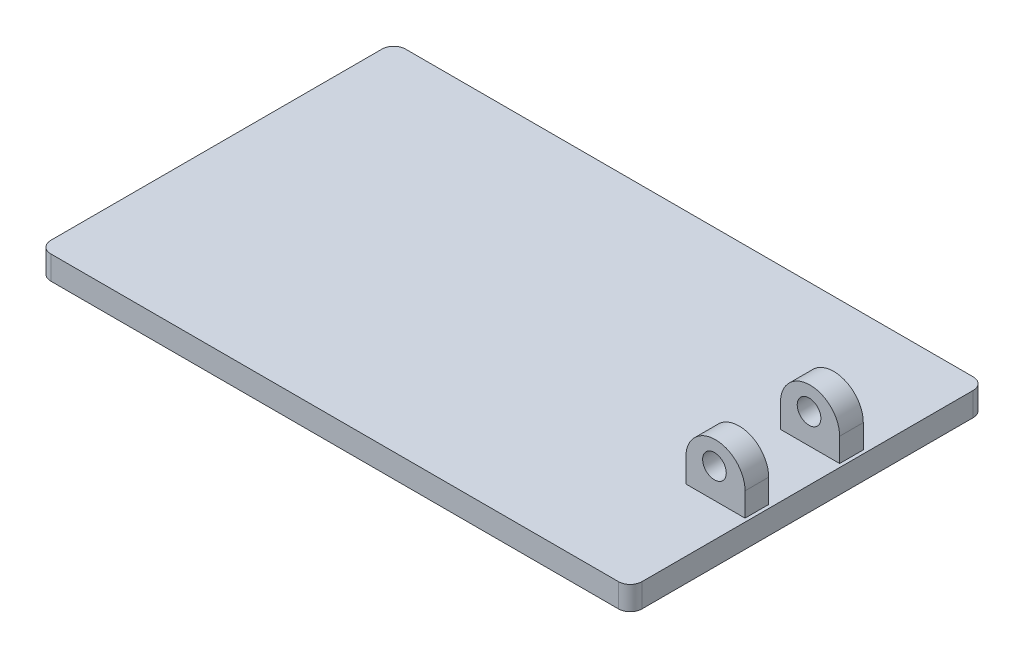
ISO-10303-21;
HEADER;
FILE_DESCRIPTION(('STEP AP214'),'2;1');
FILE_NAME('part.step','',(''),(''),'','','');
FILE_SCHEMA(('AUTOMOTIVE_DESIGN { 1 0 10303 214 1 1 1 1 }'));
ENDSEC;
DATA;
#1=APPLICATION_CONTEXT('core data for automotive mechanical design processes');
#2=APPLICATION_PROTOCOL_DEFINITION('international standard','automotive_design',2000,#1);
#3=PRODUCT_CONTEXT('',#1,'mechanical');
#4=PRODUCT('Part','Part','',(#3));
#5=PRODUCT_RELATED_PRODUCT_CATEGORY('part','',(#4));
#6=PRODUCT_DEFINITION_FORMATION('','',#4);
#7=PRODUCT_DEFINITION_CONTEXT('part definition',#1,'design');
#8=PRODUCT_DEFINITION('design','',#6,#7);
#9=PRODUCT_DEFINITION_SHAPE('','',#8);
#10=(LENGTH_UNIT() NAMED_UNIT(*) SI_UNIT(.MILLI.,.METRE.));
#11=(NAMED_UNIT(*) PLANE_ANGLE_UNIT() SI_UNIT($,.RADIAN.));
#12=(NAMED_UNIT(*) SI_UNIT($,.STERADIAN.) SOLID_ANGLE_UNIT());
#13=UNCERTAINTY_MEASURE_WITH_UNIT(LENGTH_MEASURE(1.E-05),#10,'distance_accuracy_value','');
#14=(GEOMETRIC_REPRESENTATION_CONTEXT(3) GLOBAL_UNCERTAINTY_ASSIGNED_CONTEXT((#13)) GLOBAL_UNIT_ASSIGNED_CONTEXT((#10,
#11,#12)) REPRESENTATION_CONTEXT('',''));
#15=CARTESIAN_POINT('',(0.,0.,0.));
#16=DIRECTION('',(0.,0.,1.));
#17=DIRECTION('',(1.,0.,0.));
#18=AXIS2_PLACEMENT_3D('',#15,#16,#17);
#19=CARTESIAN_POINT('',(0.,20.,0.));
#20=DIRECTION('',(0.,1.,0.));
#21=DIRECTION('',(0.,0.,1.));
#22=AXIS2_PLACEMENT_3D('',#19,#20,#21);
#23=PLANE('',#22);
#24=DIRECTION('',(-1.,0.,0.));
#25=VECTOR('',#24,1.);
#26=CARTESIAN_POINT('',(-250.,20.,-150.));
#27=LINE('',#26,#25);
#28=CARTESIAN_POINT('',(240.,20.,-150.));
#29=VERTEX_POINT('',#28);
#30=CARTESIAN_POINT('',(-240.,20.,-150.));
#31=VERTEX_POINT('',#30);
#32=EDGE_CURVE('E226',#29,#31,#27,.T.);
#33=ORIENTED_EDGE('',*,*,#32,.T.);
#34=CARTESIAN_POINT('',(-240.,20.,-140.));
#35=DIRECTION('',(0.,1.,0.));
#36=DIRECTION('',(0.,0.,1.));
#37=AXIS2_PLACEMENT_3D('',#34,#35,#36);
#38=CIRCLE('',#37,10.);
#39=CARTESIAN_POINT('',(-250.,20.,-140.));
#40=VERTEX_POINT('',#39);
#41=EDGE_CURVE('E271',#31,#40,#38,.T.);
#42=ORIENTED_EDGE('',*,*,#41,.T.);
#43=DIRECTION('',(0.,0.,1.));
#44=VECTOR('',#43,1.);
#45=CARTESIAN_POINT('',(-250.,20.,-150.));
#46=LINE('',#45,#44);
#47=CARTESIAN_POINT('',(-250.,20.,140.));
#48=VERTEX_POINT('',#47);
#49=EDGE_CURVE('E230',#40,#48,#46,.T.);
#50=ORIENTED_EDGE('',*,*,#49,.T.);
#51=CARTESIAN_POINT('',(-240.,20.,140.));
#52=DIRECTION('',(0.,1.,0.));
#53=DIRECTION('',(0.,0.,1.));
#54=AXIS2_PLACEMENT_3D('',#51,#52,#53);
#55=CIRCLE('',#54,10.);
#56=CARTESIAN_POINT('',(-240.,20.,150.));
#57=VERTEX_POINT('',#56);
#58=EDGE_CURVE('E53',#48,#57,#55,.T.);
#59=ORIENTED_EDGE('',*,*,#58,.T.);
#60=DIRECTION('',(1.,0.,0.));
#61=VECTOR('',#60,1.);
#62=CARTESIAN_POINT('',(-250.,20.,150.));
#63=LINE('',#62,#61);
#64=CARTESIAN_POINT('',(240.,20.,150.));
#65=VERTEX_POINT('',#64);
#66=EDGE_CURVE('E232',#57,#65,#63,.T.);
#67=ORIENTED_EDGE('',*,*,#66,.T.);
#68=CARTESIAN_POINT('',(240.,20.,140.));
#69=DIRECTION('',(0.,1.,0.));
#70=DIRECTION('',(0.,0.,1.));
#71=AXIS2_PLACEMENT_3D('',#68,#69,#70);
#72=CIRCLE('',#71,10.);
#73=CARTESIAN_POINT('',(250.,20.,140.));
#74=VERTEX_POINT('',#73);
#75=EDGE_CURVE('E267',#65,#74,#72,.T.);
#76=ORIENTED_EDGE('',*,*,#75,.T.);
#77=DIRECTION('',(0.,0.,-1.));
#78=VECTOR('',#77,1.);
#79=CARTESIAN_POINT('',(250.,20.,-150.));
#80=LINE('',#79,#78);
#81=CARTESIAN_POINT('',(250.,20.,-140.));
#82=VERTEX_POINT('',#81);
#83=EDGE_CURVE('E223',#74,#82,#80,.T.);
#84=ORIENTED_EDGE('',*,*,#83,.T.);
#85=CARTESIAN_POINT('',(240.,20.,-140.));
#86=DIRECTION('',(0.,1.,0.));
#87=DIRECTION('',(0.,0.,1.));
#88=AXIS2_PLACEMENT_3D('',#85,#86,#87);
#89=CIRCLE('',#88,10.);
#90=EDGE_CURVE('E269',#82,#29,#89,.T.);
#91=ORIENTED_EDGE('',*,*,#90,.T.);
#92=EDGE_LOOP('',(#33,#42,#50,#59,#67,#76,#84,#91));
#93=FACE_BOUND('',#92,.T.);
#94=DIRECTION('',(0.,0.,1.));
#95=VECTOR('',#94,1.);
#96=CARTESIAN_POINT('',(197.091467049358,20.,0.));
#97=LINE('',#96,#95);
#98=CARTESIAN_POINT('',(197.091467049358,20.,30.));
#99=VERTEX_POINT('',#98);
#100=CARTESIAN_POINT('',(197.091467049358,20.,50.));
#101=VERTEX_POINT('',#100);
#102=EDGE_CURVE('E216',#99,#101,#97,.T.);
#103=ORIENTED_EDGE('',*,*,#102,.F.);
#104=DIRECTION('',(1.,0.,0.));
#105=VECTOR('',#104,1.);
#106=CARTESIAN_POINT('',(0.,20.,30.));
#107=LINE('',#106,#105);
#108=CARTESIAN_POINT('',(247.091467049358,20.,30.));
#109=VERTEX_POINT('',#108);
#110=EDGE_CURVE('E214',#99,#109,#107,.T.);
#111=ORIENTED_EDGE('',*,*,#110,.T.);
#112=DIRECTION('',(0.,0.,-1.));
#113=VECTOR('',#112,1.);
#114=CARTESIAN_POINT('',(247.091467049358,20.,0.));
#115=LINE('',#114,#113);
#116=CARTESIAN_POINT('',(247.091467049358,20.,50.));
#117=VERTEX_POINT('',#116);
#118=EDGE_CURVE('E219',#117,#109,#115,.T.);
#119=ORIENTED_EDGE('',*,*,#118,.F.);
#120=DIRECTION('',(1.,0.,0.));
#121=VECTOR('',#120,1.);
#122=CARTESIAN_POINT('',(0.,20.,50.));
#123=LINE('',#122,#121);
#124=EDGE_CURVE('E209',#101,#117,#123,.T.);
#125=ORIENTED_EDGE('',*,*,#124,.F.);
#126=EDGE_LOOP('',(#103,#111,#119,#125));
#127=FACE_BOUND('',#126,.T.);
#128=DIRECTION('',(0.,0.,1.));
#129=VECTOR('',#128,1.);
#130=CARTESIAN_POINT('',(247.091467049358,20.,0.));
#131=LINE('',#130,#129);
#132=CARTESIAN_POINT('',(247.091467049358,20.,-50.));
#133=VERTEX_POINT('',#132);
#134=CARTESIAN_POINT('',(247.091467049358,20.,-30.));
#135=VERTEX_POINT('',#134);
#136=EDGE_CURVE('E188',#133,#135,#131,.T.);
#137=ORIENTED_EDGE('',*,*,#136,.T.);
#138=DIRECTION('',(-1.,0.,0.));
#139=VECTOR('',#138,1.);
#140=CARTESIAN_POINT('',(0.,20.,-30.));
#141=LINE('',#140,#139);
#142=CARTESIAN_POINT('',(197.091467049358,20.,-30.));
#143=VERTEX_POINT('',#142);
#144=EDGE_CURVE('E185',#135,#143,#141,.T.);
#145=ORIENTED_EDGE('',*,*,#144,.T.);
#146=DIRECTION('',(0.,0.,-1.));
#147=VECTOR('',#146,1.);
#148=CARTESIAN_POINT('',(197.091467049358,20.,0.));
#149=LINE('',#148,#147);
#150=CARTESIAN_POINT('',(197.091467049358,20.,-50.));
#151=VERTEX_POINT('',#150);
#152=EDGE_CURVE('E170',#143,#151,#149,.T.);
#153=ORIENTED_EDGE('',*,*,#152,.T.);
#154=DIRECTION('',(-1.,0.,0.));
#155=VECTOR('',#154,1.);
#156=CARTESIAN_POINT('',(0.,20.,-50.));
#157=LINE('',#156,#155);
#158=EDGE_CURVE('E181',#133,#151,#157,.T.);
#159=ORIENTED_EDGE('',*,*,#158,.F.);
#160=EDGE_LOOP('',(#137,#145,#153,#159));
#161=FACE_BOUND('',#160,.T.);
#162=ADVANCED_FACE('F33',(#93,#127,#161),#23,.T.);
#163=CARTESIAN_POINT('',(250.,20.,-150.));
#164=DIRECTION('',(-1.,0.,0.));
#165=DIRECTION('',(0.,0.,1.));
#166=AXIS2_PLACEMENT_3D('',#163,#164,#165);
#167=PLANE('',#166);
#168=DIRECTION('',(0.,0.,-1.));
#169=VECTOR('',#168,1.);
#170=CARTESIAN_POINT('',(250.,0.,-150.));
#171=LINE('',#170,#169);
#172=CARTESIAN_POINT('',(250.,0.,140.));
#173=VERTEX_POINT('',#172);
#174=CARTESIAN_POINT('',(250.,0.,-140.));
#175=VERTEX_POINT('',#174);
#176=EDGE_CURVE('E222',#173,#175,#171,.T.);
#177=ORIENTED_EDGE('',*,*,#176,.T.);
#178=DIRECTION('',(0.,-1.,0.));
#179=VECTOR('',#178,1.);
#180=CARTESIAN_POINT('',(250.,20.,-140.));
#181=LINE('',#180,#179);
#182=EDGE_CURVE('E276',#175,#82,#181,.F.);
#183=ORIENTED_EDGE('',*,*,#182,.T.);
#184=ORIENTED_EDGE('',*,*,#83,.F.);
#185=DIRECTION('',(0.,-1.,0.));
#186=VECTOR('',#185,1.);
#187=CARTESIAN_POINT('',(250.,20.,140.));
#188=LINE('',#187,#186);
#189=EDGE_CURVE('E273',#74,#173,#188,.T.);
#190=ORIENTED_EDGE('',*,*,#189,.T.);
#191=EDGE_LOOP('',(#177,#183,#184,#190));
#192=FACE_BOUND('',#191,.T.);
#193=ADVANCED_FACE('F292',(#192),#167,.F.);
#194=CARTESIAN_POINT('',(-250.,20.,-150.));
#195=DIRECTION('',(0.,0.,1.));
#196=DIRECTION('',(1.,0.,0.));
#197=AXIS2_PLACEMENT_3D('',#194,#195,#196);
#198=PLANE('',#197);
#199=DIRECTION('',(-1.,0.,0.));
#200=VECTOR('',#199,1.);
#201=CARTESIAN_POINT('',(-250.,0.,-150.));
#202=LINE('',#201,#200);
#203=CARTESIAN_POINT('',(240.,0.,-150.));
#204=VERTEX_POINT('',#203);
#205=CARTESIAN_POINT('',(-240.,0.,-150.));
#206=VERTEX_POINT('',#205);
#207=EDGE_CURVE('E237',#204,#206,#202,.T.);
#208=ORIENTED_EDGE('',*,*,#207,.T.);
#209=DIRECTION('',(0.,-1.,0.));
#210=VECTOR('',#209,1.);
#211=CARTESIAN_POINT('',(-240.,20.,-150.));
#212=LINE('',#211,#210);
#213=EDGE_CURVE('E264',#206,#31,#212,.F.);
#214=ORIENTED_EDGE('',*,*,#213,.T.);
#215=ORIENTED_EDGE('',*,*,#32,.F.);
#216=DIRECTION('',(0.,-1.,0.));
#217=VECTOR('',#216,1.);
#218=CARTESIAN_POINT('',(240.,20.,-150.));
#219=LINE('',#218,#217);
#220=EDGE_CURVE('E261',#29,#204,#219,.T.);
#221=ORIENTED_EDGE('',*,*,#220,.T.);
#222=EDGE_LOOP('',(#208,#214,#215,#221));
#223=FACE_BOUND('',#222,.T.);
#224=ADVANCED_FACE('F302',(#223),#198,.F.);
#225=CARTESIAN_POINT('',(-250.,20.,-150.));
#226=DIRECTION('',(1.,0.,0.));
#227=DIRECTION('',(0.,0.,-1.));
#228=AXIS2_PLACEMENT_3D('',#225,#226,#227);
#229=PLANE('',#228);
#230=ORIENTED_EDGE('',*,*,#49,.F.);
#231=DIRECTION('',(0.,-1.,0.));
#232=VECTOR('',#231,1.);
#233=CARTESIAN_POINT('',(-250.,20.,-140.));
#234=LINE('',#233,#232);
#235=CARTESIAN_POINT('',(-250.,0.,-140.));
#236=VERTEX_POINT('',#235);
#237=EDGE_CURVE('E250',#40,#236,#234,.T.);
#238=ORIENTED_EDGE('',*,*,#237,.T.);
#239=DIRECTION('',(0.,0.,1.));
#240=VECTOR('',#239,1.);
#241=CARTESIAN_POINT('',(-250.,0.,-150.));
#242=LINE('',#241,#240);
#243=CARTESIAN_POINT('',(-250.,0.,140.));
#244=VERTEX_POINT('',#243);
#245=EDGE_CURVE('E240',#236,#244,#242,.T.);
#246=ORIENTED_EDGE('',*,*,#245,.T.);
#247=DIRECTION('',(0.,-1.,0.));
#248=VECTOR('',#247,1.);
#249=CARTESIAN_POINT('',(-250.,20.,140.));
#250=LINE('',#249,#248);
#251=EDGE_CURVE('E234',#244,#48,#250,.F.);
#252=ORIENTED_EDGE('',*,*,#251,.T.);
#253=EDGE_LOOP('',(#230,#238,#246,#252));
#254=FACE_BOUND('',#253,.T.);
#255=ADVANCED_FACE('F310',(#254),#229,.F.);
#256=CARTESIAN_POINT('',(-250.,20.,150.));
#257=DIRECTION('',(0.,0.,-1.));
#258=DIRECTION('',(-1.,0.,0.));
#259=AXIS2_PLACEMENT_3D('',#256,#257,#258);
#260=PLANE('',#259);
#261=DIRECTION('',(1.,0.,0.));
#262=VECTOR('',#261,1.);
#263=CARTESIAN_POINT('',(-250.,0.,150.));
#264=LINE('',#263,#262);
#265=CARTESIAN_POINT('',(-240.,0.,150.));
#266=VERTEX_POINT('',#265);
#267=CARTESIAN_POINT('',(240.,0.,150.));
#268=VERTEX_POINT('',#267);
#269=EDGE_CURVE('E227',#266,#268,#264,.T.);
#270=ORIENTED_EDGE('',*,*,#269,.T.);
#271=DIRECTION('',(0.,-1.,0.));
#272=VECTOR('',#271,1.);
#273=CARTESIAN_POINT('',(240.,20.,150.));
#274=LINE('',#273,#272);
#275=EDGE_CURVE('E11',#268,#65,#274,.F.);
#276=ORIENTED_EDGE('',*,*,#275,.T.);
#277=ORIENTED_EDGE('',*,*,#66,.F.);
#278=DIRECTION('',(0.,-1.,0.));
#279=VECTOR('',#278,1.);
#280=CARTESIAN_POINT('',(-240.,20.,150.));
#281=LINE('',#280,#279);
#282=EDGE_CURVE('E41',#57,#266,#281,.T.);
#283=ORIENTED_EDGE('',*,*,#282,.T.);
#284=EDGE_LOOP('',(#270,#276,#277,#283));
#285=FACE_BOUND('',#284,.T.);
#286=ADVANCED_FACE('F280',(#285),#260,.F.);
#287=CARTESIAN_POINT('',(0.,0.,0.));
#288=DIRECTION('',(0.,1.,0.));
#289=DIRECTION('',(0.,0.,1.));
#290=AXIS2_PLACEMENT_3D('',#287,#288,#289);
#291=PLANE('',#290);
#292=ORIENTED_EDGE('',*,*,#245,.F.);
#293=CARTESIAN_POINT('',(-240.,0.,-140.));
#294=DIRECTION('',(0.,1.,0.));
#295=DIRECTION('',(0.,0.,1.));
#296=AXIS2_PLACEMENT_3D('',#293,#294,#295);
#297=CIRCLE('',#296,10.);
#298=EDGE_CURVE('E259',#236,#206,#297,.F.);
#299=ORIENTED_EDGE('',*,*,#298,.T.);
#300=ORIENTED_EDGE('',*,*,#207,.F.);
#301=CARTESIAN_POINT('',(240.,0.,-140.));
#302=DIRECTION('',(0.,1.,0.));
#303=DIRECTION('',(0.,0.,1.));
#304=AXIS2_PLACEMENT_3D('',#301,#302,#303);
#305=CIRCLE('',#304,10.);
#306=EDGE_CURVE('E257',#204,#175,#305,.F.);
#307=ORIENTED_EDGE('',*,*,#306,.T.);
#308=ORIENTED_EDGE('',*,*,#176,.F.);
#309=CARTESIAN_POINT('',(240.,0.,140.));
#310=DIRECTION('',(0.,1.,0.));
#311=DIRECTION('',(0.,0.,1.));
#312=AXIS2_PLACEMENT_3D('',#309,#310,#311);
#313=CIRCLE('',#312,10.);
#314=EDGE_CURVE('E255',#173,#268,#313,.F.);
#315=ORIENTED_EDGE('',*,*,#314,.T.);
#316=ORIENTED_EDGE('',*,*,#269,.F.);
#317=CARTESIAN_POINT('',(-240.,0.,140.));
#318=DIRECTION('',(0.,1.,0.));
#319=DIRECTION('',(0.,0.,1.));
#320=AXIS2_PLACEMENT_3D('',#317,#318,#319);
#321=CIRCLE('',#320,10.);
#322=EDGE_CURVE('E253',#266,#244,#321,.F.);
#323=ORIENTED_EDGE('',*,*,#322,.T.);
#324=EDGE_LOOP('',(#292,#299,#300,#307,#308,#315,#316,#323));
#325=FACE_BOUND('',#324,.T.);
#326=ADVANCED_FACE('F284',(#325),#291,.F.);
#327=CARTESIAN_POINT('',(247.091467049358,40.,30.));
#328=DIRECTION('',(1.,0.,0.));
#329=DIRECTION('',(0.,0.,-1.));
#330=AXIS2_PLACEMENT_3D('',#327,#328,#329);
#331=PLANE('',#330);
#332=DIRECTION('',(0.,1.,0.));
#333=VECTOR('',#332,1.);
#334=CARTESIAN_POINT('',(247.091467049358,40.,50.));
#335=LINE('',#334,#333);
#336=CARTESIAN_POINT('',(247.091467049358,40.,50.));
#337=VERTEX_POINT('',#336);
#338=EDGE_CURVE('E190',#117,#337,#335,.T.);
#339=ORIENTED_EDGE('',*,*,#338,.F.);
#340=ORIENTED_EDGE('',*,*,#118,.T.);
#341=DIRECTION('',(0.,1.,0.));
#342=VECTOR('',#341,1.);
#343=CARTESIAN_POINT('',(247.091467049358,40.,30.));
#344=LINE('',#343,#342);
#345=CARTESIAN_POINT('',(247.091467049358,40.,30.));
#346=VERTEX_POINT('',#345);
#347=EDGE_CURVE('E191',#109,#346,#344,.T.);
#348=ORIENTED_EDGE('',*,*,#347,.T.);
#349=DIRECTION('',(0.,0.,1.));
#350=VECTOR('',#349,1.);
#351=CARTESIAN_POINT('',(247.091467049358,40.,30.));
#352=LINE('',#351,#350);
#353=EDGE_CURVE('E200',#346,#337,#352,.T.);
#354=ORIENTED_EDGE('',*,*,#353,.T.);
#355=EDGE_LOOP('',(#339,#340,#348,#354));
#356=FACE_BOUND('',#355,.T.);
#357=ADVANCED_FACE('F325',(#356),#331,.T.);
#358=CARTESIAN_POINT('',(197.091467049358,40.,30.));
#359=DIRECTION('',(-1.,0.,0.));
#360=DIRECTION('',(0.,0.,1.));
#361=AXIS2_PLACEMENT_3D('',#358,#359,#360);
#362=PLANE('',#361);
#363=DIRECTION('',(0.,-1.,0.));
#364=VECTOR('',#363,1.);
#365=CARTESIAN_POINT('',(197.091467049358,40.,30.));
#366=LINE('',#365,#364);
#367=CARTESIAN_POINT('',(197.091467049358,40.,30.));
#368=VERTEX_POINT('',#367);
#369=EDGE_CURVE('E197',#368,#99,#366,.T.);
#370=ORIENTED_EDGE('',*,*,#369,.T.);
#371=ORIENTED_EDGE('',*,*,#102,.T.);
#372=DIRECTION('',(0.,-1.,0.));
#373=VECTOR('',#372,1.);
#374=CARTESIAN_POINT('',(197.091467049358,40.,50.));
#375=LINE('',#374,#373);
#376=CARTESIAN_POINT('',(197.091467049358,40.,50.));
#377=VERTEX_POINT('',#376);
#378=EDGE_CURVE('E194',#377,#101,#375,.T.);
#379=ORIENTED_EDGE('',*,*,#378,.F.);
#380=DIRECTION('',(0.,0.,1.));
#381=VECTOR('',#380,1.);
#382=CARTESIAN_POINT('',(197.091467049358,40.,30.));
#383=LINE('',#382,#381);
#384=EDGE_CURVE('E207',#368,#377,#383,.T.);
#385=ORIENTED_EDGE('',*,*,#384,.F.);
#386=EDGE_LOOP('',(#370,#371,#379,#385));
#387=FACE_BOUND('',#386,.T.);
#388=ADVANCED_FACE('F446',(#387),#362,.T.);
#389=CARTESIAN_POINT('',(222.091467049358,40.,30.));
#390=DIRECTION('',(0.,0.,1.));
#391=DIRECTION('',(1.,0.,0.));
#392=AXIS2_PLACEMENT_3D('',#389,#390,#391);
#393=CYLINDRICAL_SURFACE('',#392,25.);
#394=CARTESIAN_POINT('',(222.091467049358,40.,50.));
#395=DIRECTION('',(0.,0.,1.));
#396=DIRECTION('',(1.,0.,0.));
#397=AXIS2_PLACEMENT_3D('',#394,#395,#396);
#398=CIRCLE('',#397,25.);
#399=EDGE_CURVE('E202',#337,#377,#398,.T.);
#400=ORIENTED_EDGE('',*,*,#399,.F.);
#401=ORIENTED_EDGE('',*,*,#353,.F.);
#402=CARTESIAN_POINT('',(222.091467049358,40.,30.));
#403=DIRECTION('',(0.,0.,1.));
#404=DIRECTION('',(1.,0.,0.));
#405=AXIS2_PLACEMENT_3D('',#402,#403,#404);
#406=CIRCLE('',#405,25.);
#407=EDGE_CURVE('E193',#346,#368,#406,.T.);
#408=ORIENTED_EDGE('',*,*,#407,.T.);
#409=ORIENTED_EDGE('',*,*,#384,.T.);
#410=EDGE_LOOP('',(#400,#401,#408,#409));
#411=FACE_BOUND('',#410,.T.);
#412=ADVANCED_FACE('F438',(#411),#393,.T.);
#413=CARTESIAN_POINT('',(222.091467049358,40.,30.));
#414=DIRECTION('',(0.,0.,1.));
#415=DIRECTION('',(1.,0.,0.));
#416=AXIS2_PLACEMENT_3D('',#413,#414,#415);
#417=PLANE('',#416);
#418=CARTESIAN_POINT('',(221.22008018139,45.1211093535115,30.));
#419=DIRECTION('',(0.,0.,1.));
#420=DIRECTION('',(1.,0.,0.));
#421=AXIS2_PLACEMENT_3D('',#418,#419,#420);
#422=CIRCLE('',#421,10.);
#423=CARTESIAN_POINT('',(231.22008018139,45.1211093535115,30.));
#424=VERTEX_POINT('',#423);
#425=EDGE_CURVE('E178',#424,#424,#422,.T.);
#426=ORIENTED_EDGE('',*,*,#425,.T.);
#427=EDGE_LOOP('',(#426));
#428=FACE_BOUND('',#427,.T.);
#429=ORIENTED_EDGE('',*,*,#110,.F.);
#430=ORIENTED_EDGE('',*,*,#369,.F.);
#431=ORIENTED_EDGE('',*,*,#407,.F.);
#432=ORIENTED_EDGE('',*,*,#347,.F.);
#433=EDGE_LOOP('',(#429,#430,#431,#432));
#434=FACE_BOUND('',#433,.T.);
#435=ADVANCED_FACE('F430',(#428,#434),#417,.F.);
#436=CARTESIAN_POINT('',(222.091467049358,40.,50.));
#437=DIRECTION('',(0.,0.,1.));
#438=DIRECTION('',(1.,0.,0.));
#439=AXIS2_PLACEMENT_3D('',#436,#437,#438);
#440=PLANE('',#439);
#441=CARTESIAN_POINT('',(221.22008018139,45.1211093535115,50.));
#442=DIRECTION('',(0.,0.,1.));
#443=DIRECTION('',(1.,0.,0.));
#444=AXIS2_PLACEMENT_3D('',#441,#442,#443);
#445=CIRCLE('',#444,10.);
#446=CARTESIAN_POINT('',(231.22008018139,45.1211093535115,50.));
#447=VERTEX_POINT('',#446);
#448=EDGE_CURVE('E248',#447,#447,#445,.T.);
#449=ORIENTED_EDGE('',*,*,#448,.F.);
#450=EDGE_LOOP('',(#449));
#451=FACE_BOUND('',#450,.T.);
#452=ORIENTED_EDGE('',*,*,#378,.T.);
#453=ORIENTED_EDGE('',*,*,#124,.T.);
#454=ORIENTED_EDGE('',*,*,#338,.T.);
#455=ORIENTED_EDGE('',*,*,#399,.T.);
#456=EDGE_LOOP('',(#452,#453,#454,#455));
#457=FACE_BOUND('',#456,.T.);
#458=ADVANCED_FACE('F416',(#451,#457),#440,.T.);
#459=CARTESIAN_POINT('',(247.091467049358,40.,-30.));
#460=DIRECTION('',(-1.,0.,0.));
#461=DIRECTION('',(0.,0.,1.));
#462=AXIS2_PLACEMENT_3D('',#459,#460,#461);
#463=PLANE('',#462);
#464=ORIENTED_EDGE('',*,*,#136,.F.);
#465=DIRECTION('',(0.,1.,0.));
#466=VECTOR('',#465,1.);
#467=CARTESIAN_POINT('',(247.091467049358,40.,-50.));
#468=LINE('',#467,#466);
#469=CARTESIAN_POINT('',(247.091467049358,40.,-50.));
#470=VERTEX_POINT('',#469);
#471=EDGE_CURVE('E175',#133,#470,#468,.T.);
#472=ORIENTED_EDGE('',*,*,#471,.T.);
#473=DIRECTION('',(0.,0.,-1.));
#474=VECTOR('',#473,1.);
#475=CARTESIAN_POINT('',(247.091467049358,40.,-30.));
#476=LINE('',#475,#474);
#477=CARTESIAN_POINT('',(247.091467049358,40.,-30.));
#478=VERTEX_POINT('',#477);
#479=EDGE_CURVE('E166',#478,#470,#476,.T.);
#480=ORIENTED_EDGE('',*,*,#479,.F.);
#481=DIRECTION('',(0.,1.,0.));
#482=VECTOR('',#481,1.);
#483=CARTESIAN_POINT('',(247.091467049358,40.,-30.));
#484=LINE('',#483,#482);
#485=EDGE_CURVE('E153',#135,#478,#484,.T.);
#486=ORIENTED_EDGE('',*,*,#485,.F.);
#487=EDGE_LOOP('',(#464,#472,#480,#486));
#488=FACE_BOUND('',#487,.T.);
#489=ADVANCED_FACE('F408',(#488),#463,.F.);
#490=CARTESIAN_POINT('',(222.091467049358,40.,-30.));
#491=DIRECTION('',(0.,0.,-1.));
#492=DIRECTION('',(-1.,0.,0.));
#493=AXIS2_PLACEMENT_3D('',#490,#491,#492);
#494=CYLINDRICAL_SURFACE('',#493,25.);
#495=CARTESIAN_POINT('',(222.091467049358,40.,-50.));
#496=DIRECTION('',(0.,0.,1.));
#497=DIRECTION('',(1.,0.,0.));
#498=AXIS2_PLACEMENT_3D('',#495,#496,#497);
#499=CIRCLE('',#498,25.);
#500=CARTESIAN_POINT('',(197.091467049358,40.,-50.));
#501=VERTEX_POINT('',#500);
#502=EDGE_CURVE('E162',#470,#501,#499,.T.);
#503=ORIENTED_EDGE('',*,*,#502,.T.);
#504=DIRECTION('',(0.,0.,-1.));
#505=VECTOR('',#504,1.);
#506=CARTESIAN_POINT('',(197.091467049358,40.,-30.));
#507=LINE('',#506,#505);
#508=CARTESIAN_POINT('',(197.091467049358,40.,-30.));
#509=VERTEX_POINT('',#508);
#510=EDGE_CURVE('E157',#509,#501,#507,.T.);
#511=ORIENTED_EDGE('',*,*,#510,.F.);
#512=CARTESIAN_POINT('',(222.091467049358,40.,-30.));
#513=DIRECTION('',(0.,0.,1.));
#514=DIRECTION('',(1.,0.,0.));
#515=AXIS2_PLACEMENT_3D('',#512,#513,#514);
#516=CIRCLE('',#515,25.);
#517=EDGE_CURVE('E146',#478,#509,#516,.T.);
#518=ORIENTED_EDGE('',*,*,#517,.F.);
#519=ORIENTED_EDGE('',*,*,#479,.T.);
#520=EDGE_LOOP('',(#503,#511,#518,#519));
#521=FACE_BOUND('',#520,.T.);
#522=ADVANCED_FACE('F160',(#521),#494,.T.);
#523=CARTESIAN_POINT('',(197.091467049358,40.,-30.));
#524=DIRECTION('',(1.,0.,0.));
#525=DIRECTION('',(0.,0.,-1.));
#526=AXIS2_PLACEMENT_3D('',#523,#524,#525);
#527=PLANE('',#526);
#528=ORIENTED_EDGE('',*,*,#152,.F.);
#529=DIRECTION('',(0.,-1.,0.));
#530=VECTOR('',#529,1.);
#531=CARTESIAN_POINT('',(197.091467049358,40.,-30.));
#532=LINE('',#531,#530);
#533=EDGE_CURVE('E151',#509,#143,#532,.T.);
#534=ORIENTED_EDGE('',*,*,#533,.F.);
#535=ORIENTED_EDGE('',*,*,#510,.T.);
#536=DIRECTION('',(0.,-1.,0.));
#537=VECTOR('',#536,1.);
#538=CARTESIAN_POINT('',(197.091467049358,40.,-50.));
#539=LINE('',#538,#537);
#540=EDGE_CURVE('E177',#501,#151,#539,.T.);
#541=ORIENTED_EDGE('',*,*,#540,.T.);
#542=EDGE_LOOP('',(#528,#534,#535,#541));
#543=FACE_BOUND('',#542,.T.);
#544=ADVANCED_FACE('F169',(#543),#527,.F.);
#545=CARTESIAN_POINT('',(222.091467049358,40.,-30.));
#546=DIRECTION('',(0.,0.,-1.));
#547=DIRECTION('',(1.,0.,0.));
#548=AXIS2_PLACEMENT_3D('',#545,#546,#547);
#549=PLANE('',#548);
#550=CARTESIAN_POINT('',(221.22008018139,45.1211093535115,-30.));
#551=DIRECTION('',(0.,0.,-1.));
#552=DIRECTION('',(-1.,0.,0.));
#553=AXIS2_PLACEMENT_3D('',#550,#551,#552);
#554=CIRCLE('',#553,10.);
#555=CARTESIAN_POINT('',(211.22008018139,45.1211093535115,-30.));
#556=VERTEX_POINT('',#555);
#557=EDGE_CURVE('E247',#556,#556,#554,.T.);
#558=ORIENTED_EDGE('',*,*,#557,.T.);
#559=EDGE_LOOP('',(#558));
#560=FACE_BOUND('',#559,.T.);
#561=ORIENTED_EDGE('',*,*,#144,.F.);
#562=ORIENTED_EDGE('',*,*,#485,.T.);
#563=ORIENTED_EDGE('',*,*,#517,.T.);
#564=ORIENTED_EDGE('',*,*,#533,.T.);
#565=EDGE_LOOP('',(#561,#562,#563,#564));
#566=FACE_BOUND('',#565,.T.);
#567=ADVANCED_FACE('F149',(#560,#566),#549,.F.);
#568=CARTESIAN_POINT('',(222.091467049358,40.,-50.));
#569=DIRECTION('',(0.,0.,-1.));
#570=DIRECTION('',(1.,0.,0.));
#571=AXIS2_PLACEMENT_3D('',#568,#569,#570);
#572=PLANE('',#571);
#573=CARTESIAN_POINT('',(221.22008018139,45.1211093535115,-50.));
#574=DIRECTION('',(0.,0.,-1.));
#575=DIRECTION('',(-1.,0.,0.));
#576=AXIS2_PLACEMENT_3D('',#573,#574,#575);
#577=CIRCLE('',#576,10.);
#578=CARTESIAN_POINT('',(211.22008018139,45.1211093535115,-50.));
#579=VERTEX_POINT('',#578);
#580=EDGE_CURVE('E244',#579,#579,#577,.T.);
#581=ORIENTED_EDGE('',*,*,#580,.F.);
#582=EDGE_LOOP('',(#581));
#583=FACE_BOUND('',#582,.T.);
#584=ORIENTED_EDGE('',*,*,#471,.F.);
#585=ORIENTED_EDGE('',*,*,#158,.T.);
#586=ORIENTED_EDGE('',*,*,#540,.F.);
#587=ORIENTED_EDGE('',*,*,#502,.F.);
#588=EDGE_LOOP('',(#584,#585,#586,#587));
#589=FACE_BOUND('',#588,.T.);
#590=ADVANCED_FACE('F375',(#583,#589),#572,.T.);
#591=CARTESIAN_POINT('',(221.22008018139,45.1211093535115,-236.));
#592=DIRECTION('',(0.,0.,1.));
#593=DIRECTION('',(1.,0.,0.));
#594=AXIS2_PLACEMENT_3D('',#591,#592,#593);
#595=CYLINDRICAL_SURFACE('',#594,10.);
#596=ORIENTED_EDGE('',*,*,#580,.T.);
#597=EDGE_LOOP('',(#596));
#598=FACE_BOUND('',#597,.T.);
#599=ORIENTED_EDGE('',*,*,#557,.F.);
#600=EDGE_LOOP('',(#599));
#601=FACE_BOUND('',#600,.T.);
#602=ADVANCED_FACE('F366',(#598,#601),#595,.F.);
#603=ORIENTED_EDGE('',*,*,#448,.T.);
#604=EDGE_LOOP('',(#603));
#605=FACE_BOUND('',#604,.T.);
#606=ORIENTED_EDGE('',*,*,#425,.F.);
#607=EDGE_LOOP('',(#606));
#608=FACE_BOUND('',#607,.T.);
#609=ADVANCED_FACE('F337',(#605,#608),#595,.F.);
#610=CARTESIAN_POINT('',(-240.,20.,-140.));
#611=DIRECTION('',(0.,-1.,0.));
#612=DIRECTION('',(0.,0.,-1.));
#613=AXIS2_PLACEMENT_3D('',#610,#611,#612);
#614=CYLINDRICAL_SURFACE('',#613,10.);
#615=ORIENTED_EDGE('',*,*,#41,.F.);
#616=ORIENTED_EDGE('',*,*,#213,.F.);
#617=ORIENTED_EDGE('',*,*,#298,.F.);
#618=ORIENTED_EDGE('',*,*,#237,.F.);
#619=EDGE_LOOP('',(#615,#616,#617,#618));
#620=FACE_BOUND('',#619,.T.);
#621=ADVANCED_FACE('F307',(#620),#614,.T.);
#622=CARTESIAN_POINT('',(240.,20.,-140.));
#623=DIRECTION('',(0.,-1.,0.));
#624=DIRECTION('',(0.,0.,-1.));
#625=AXIS2_PLACEMENT_3D('',#622,#623,#624);
#626=CYLINDRICAL_SURFACE('',#625,10.);
#627=ORIENTED_EDGE('',*,*,#90,.F.);
#628=ORIENTED_EDGE('',*,*,#182,.F.);
#629=ORIENTED_EDGE('',*,*,#306,.F.);
#630=ORIENTED_EDGE('',*,*,#220,.F.);
#631=EDGE_LOOP('',(#627,#628,#629,#630));
#632=FACE_BOUND('',#631,.T.);
#633=ADVANCED_FACE('F299',(#632),#626,.T.);
#634=CARTESIAN_POINT('',(240.,20.,140.));
#635=DIRECTION('',(0.,-1.,0.));
#636=DIRECTION('',(0.,0.,-1.));
#637=AXIS2_PLACEMENT_3D('',#634,#635,#636);
#638=CYLINDRICAL_SURFACE('',#637,10.);
#639=ORIENTED_EDGE('',*,*,#75,.F.);
#640=ORIENTED_EDGE('',*,*,#275,.F.);
#641=ORIENTED_EDGE('',*,*,#314,.F.);
#642=ORIENTED_EDGE('',*,*,#189,.F.);
#643=EDGE_LOOP('',(#639,#640,#641,#642));
#644=FACE_BOUND('',#643,.T.);
#645=ADVANCED_FACE('F289',(#644),#638,.T.);
#646=CARTESIAN_POINT('',(-240.,20.,140.));
#647=DIRECTION('',(0.,-1.,0.));
#648=DIRECTION('',(0.,0.,-1.));
#649=AXIS2_PLACEMENT_3D('',#646,#647,#648);
#650=CYLINDRICAL_SURFACE('',#649,10.);
#651=ORIENTED_EDGE('',*,*,#58,.F.);
#652=ORIENTED_EDGE('',*,*,#251,.F.);
#653=ORIENTED_EDGE('',*,*,#322,.F.);
#654=ORIENTED_EDGE('',*,*,#282,.F.);
#655=EDGE_LOOP('',(#651,#652,#653,#654));
#656=FACE_BOUND('',#655,.T.);
#657=ADVANCED_FACE('F35',(#656),#650,.T.);
#658=CLOSED_SHELL('',(#162,#193,#224,#255,#286,#326,#357,#388,#412,#435,#458,#489,#522,#544,
#567,#590,#602,#609,#621,#633,#645,#657));
#659=MANIFOLD_SOLID_BREP('B2',#658);
#660=ADVANCED_BREP_SHAPE_REPRESENTATION('',(#18,#659),#14);
#661=SHAPE_DEFINITION_REPRESENTATION(#9,#660);
ENDSEC;
END-ISO-10303-21;
